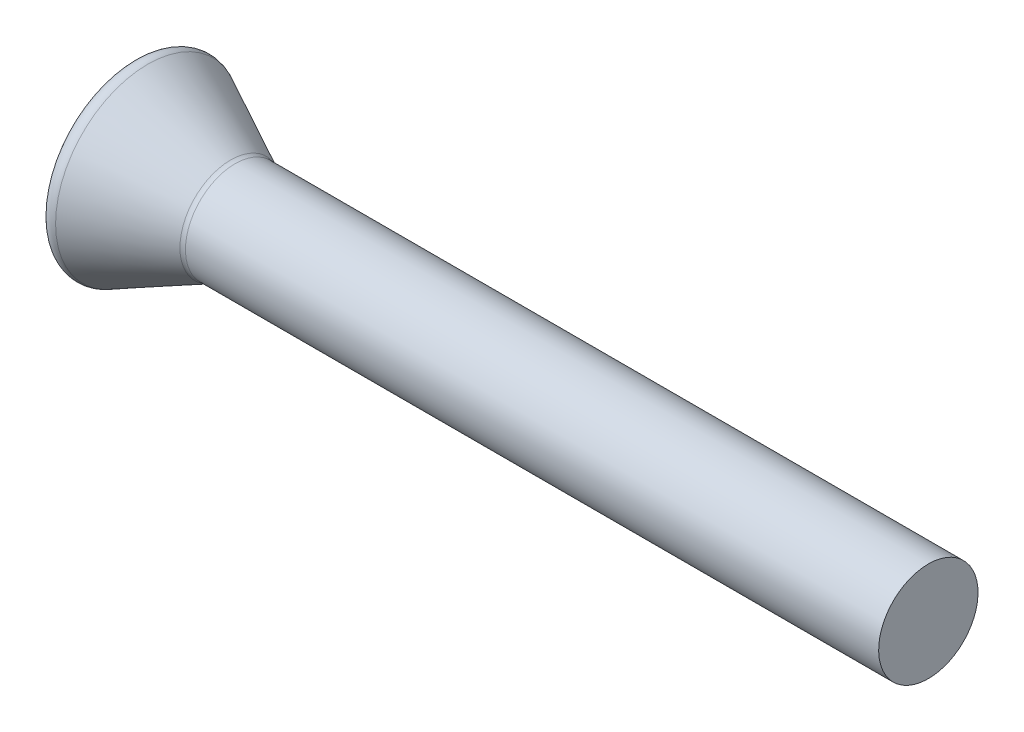
ISO-10303-21;
HEADER;
FILE_DESCRIPTION(('STEP AP214'),'2;1');
FILE_NAME('part.step','',(''),(''),'','','');
FILE_SCHEMA(('AUTOMOTIVE_DESIGN { 1 0 10303 214 1 1 1 1 }'));
ENDSEC;
DATA;
#1=APPLICATION_CONTEXT('core data for automotive mechanical design processes');
#2=APPLICATION_PROTOCOL_DEFINITION('international standard','automotive_design',2000,#1);
#3=PRODUCT_CONTEXT('',#1,'mechanical');
#4=PRODUCT('Part','Part','',(#3));
#5=PRODUCT_RELATED_PRODUCT_CATEGORY('part','',(#4));
#6=PRODUCT_DEFINITION_FORMATION('','',#4);
#7=PRODUCT_DEFINITION_CONTEXT('part definition',#1,'design');
#8=PRODUCT_DEFINITION('design','',#6,#7);
#9=PRODUCT_DEFINITION_SHAPE('','',#8);
#10=(LENGTH_UNIT() NAMED_UNIT(*) SI_UNIT(.MILLI.,.METRE.));
#11=(NAMED_UNIT(*) PLANE_ANGLE_UNIT() SI_UNIT($,.RADIAN.));
#12=(NAMED_UNIT(*) SI_UNIT($,.STERADIAN.) SOLID_ANGLE_UNIT());
#13=UNCERTAINTY_MEASURE_WITH_UNIT(LENGTH_MEASURE(1.E-05),#10,'distance_accuracy_value','');
#14=(GEOMETRIC_REPRESENTATION_CONTEXT(3) GLOBAL_UNCERTAINTY_ASSIGNED_CONTEXT((#13)) GLOBAL_UNIT_ASSIGNED_CONTEXT((#10,
#11,#12)) REPRESENTATION_CONTEXT('',''));
#15=CARTESIAN_POINT('',(0.,0.,0.));
#16=DIRECTION('',(0.,0.,1.));
#17=DIRECTION('',(1.,0.,0.));
#18=AXIS2_PLACEMENT_3D('',#15,#16,#17);
#19=CARTESIAN_POINT('',(8.,0.5,0.));
#20=DIRECTION('',(-1.,0.,0.));
#21=DIRECTION('',(0.,-1.,0.));
#22=AXIS2_PLACEMENT_3D('',#19,#20,#21);
#23=PLANE('',#22);
#24=CARTESIAN_POINT('',(8.,0.,0.));
#25=DIRECTION('',(1.,0.,0.));
#26=DIRECTION('',(0.,1.,0.));
#27=AXIS2_PLACEMENT_3D('',#24,#25,#26);
#28=CIRCLE('',#27,0.5);
#29=CARTESIAN_POINT('',(8.,0.5,0.));
#30=VERTEX_POINT('',#29);
#31=EDGE_CURVE('E65',#30,#30,#28,.T.);
#32=ORIENTED_EDGE('',*,*,#31,.T.);
#33=EDGE_LOOP('',(#32));
#34=FACE_BOUND('',#33,.T.);
#35=ADVANCED_FACE('F41',(#34),#23,.F.);
#36=CARTESIAN_POINT('',(0.,0.,0.));
#37=DIRECTION('',(1.,0.,0.));
#38=DIRECTION('',(0.,1.,0.));
#39=AXIS2_PLACEMENT_3D('',#36,#37,#38);
#40=PLANE('',#39);
#41=CARTESIAN_POINT('',(0.,0.,0.));
#42=DIRECTION('',(1.,0.,0.));
#43=DIRECTION('',(0.,1.,0.));
#44=AXIS2_PLACEMENT_3D('',#41,#42,#43);
#45=CIRCLE('',#44,0.83819660112501);
#46=CARTESIAN_POINT('',(0.,0.83819660112501,0.));
#47=VERTEX_POINT('',#46);
#48=EDGE_CURVE('E49',#47,#47,#45,.F.);
#49=ORIENTED_EDGE('',*,*,#48,.T.);
#50=EDGE_LOOP('',(#49));
#51=FACE_BOUND('',#50,.T.);
#52=ADVANCED_FACE('F81',(#51),#40,.F.);
#53=CARTESIAN_POINT('',(0.,0.,0.));
#54=DIRECTION('',(-1.,0.,0.));
#55=DIRECTION('',(0.,-1.,0.));
#56=AXIS2_PLACEMENT_3D('',#53,#54,#55);
#57=CONICAL_SURFACE('',#56,1.,0.463647609000806);
#58=CARTESIAN_POINT('',(0.144721359549996,0.,0.));
#59=DIRECTION('',(1.,0.,0.));
#60=DIRECTION('',(0.,1.,0.));
#61=AXIS2_PLACEMENT_3D('',#58,#59,#60);
#62=CIRCLE('',#61,0.927639320225002);
#63=CARTESIAN_POINT('',(0.144721359549996,0.927639320225002,0.));
#64=VERTEX_POINT('',#63);
#65=EDGE_CURVE('E54',#64,#64,#62,.T.);
#66=ORIENTED_EDGE('',*,*,#65,.T.);
#67=EDGE_LOOP('',(#66));
#68=FACE_BOUND('',#67,.T.);
#69=CARTESIAN_POINT('',(0.978885438199983,0.,0.));
#70=DIRECTION('',(-1.,0.,0.));
#71=DIRECTION('',(0.,-1.,0.));
#72=AXIS2_PLACEMENT_3D('',#69,#70,#71);
#73=CIRCLE('',#72,0.510557280900008);
#74=CARTESIAN_POINT('',(0.978885438199983,-0.510557280900008,0.));
#75=VERTEX_POINT('',#74);
#76=EDGE_CURVE('E59',#75,#75,#73,.T.);
#77=ORIENTED_EDGE('',*,*,#76,.T.);
#78=EDGE_LOOP('',(#77));
#79=FACE_BOUND('',#78,.T.);
#80=ADVANCED_FACE('F74',(#68,#79),#57,.T.);
#81=CARTESIAN_POINT('',(8.,0.,0.));
#82=DIRECTION('',(1.,0.,0.));
#83=DIRECTION('',(0.,1.,0.));
#84=AXIS2_PLACEMENT_3D('',#81,#82,#83);
#85=CYLINDRICAL_SURFACE('',#84,0.5);
#86=CARTESIAN_POINT('',(1.02360679774998,0.,0.));
#87=DIRECTION('',(1.,0.,0.));
#88=DIRECTION('',(0.,1.,0.));
#89=AXIS2_PLACEMENT_3D('',#86,#87,#88);
#90=CIRCLE('',#89,0.5);
#91=CARTESIAN_POINT('',(1.02360679774998,0.5,0.));
#92=VERTEX_POINT('',#91);
#93=EDGE_CURVE('E10',#92,#92,#90,.T.);
#94=ORIENTED_EDGE('',*,*,#93,.T.);
#95=EDGE_LOOP('',(#94));
#96=FACE_BOUND('',#95,.T.);
#97=ORIENTED_EDGE('',*,*,#31,.F.);
#98=EDGE_LOOP('',(#97));
#99=FACE_BOUND('',#98,.T.);
#100=ADVANCED_FACE('F71',(#96,#99),#85,.T.);
#101=CARTESIAN_POINT('',(0.1,0.,0.));
#102=DIRECTION('',(1.,0.,0.));
#103=DIRECTION('',(0.,1.,0.));
#104=AXIS2_PLACEMENT_3D('',#101,#102,#103);
#105=TOROIDAL_SURFACE('',#104,0.83819660112501,0.1);
#106=ORIENTED_EDGE('',*,*,#48,.F.);
#107=EDGE_LOOP('',(#106));
#108=FACE_BOUND('',#107,.T.);
#109=ORIENTED_EDGE('',*,*,#65,.F.);
#110=EDGE_LOOP('',(#109));
#111=FACE_BOUND('',#110,.T.);
#112=ADVANCED_FACE('F73',(#108,#111),#105,.T.);
#113=CARTESIAN_POINT('',(1.02360679774998,0.,0.));
#114=DIRECTION('',(1.,0.,0.));
#115=DIRECTION('',(0.,1.,0.));
#116=AXIS2_PLACEMENT_3D('',#113,#114,#115);
#117=TOROIDAL_SURFACE('',#116,0.6,0.1);
#118=ORIENTED_EDGE('',*,*,#76,.F.);
#119=EDGE_LOOP('',(#118));
#120=FACE_BOUND('',#119,.T.);
#121=ORIENTED_EDGE('',*,*,#93,.F.);
#122=EDGE_LOOP('',(#121));
#123=FACE_BOUND('',#122,.T.);
#124=ADVANCED_FACE('F43',(#120,#123),#117,.F.);
#125=CLOSED_SHELL('',(#35,#52,#80,#100,#112,#124));
#126=MANIFOLD_SOLID_BREP('B2',#125);
#127=ADVANCED_BREP_SHAPE_REPRESENTATION('',(#18,#126),#14);
#128=SHAPE_DEFINITION_REPRESENTATION(#9,#127);
ENDSEC;
END-ISO-10303-21;
